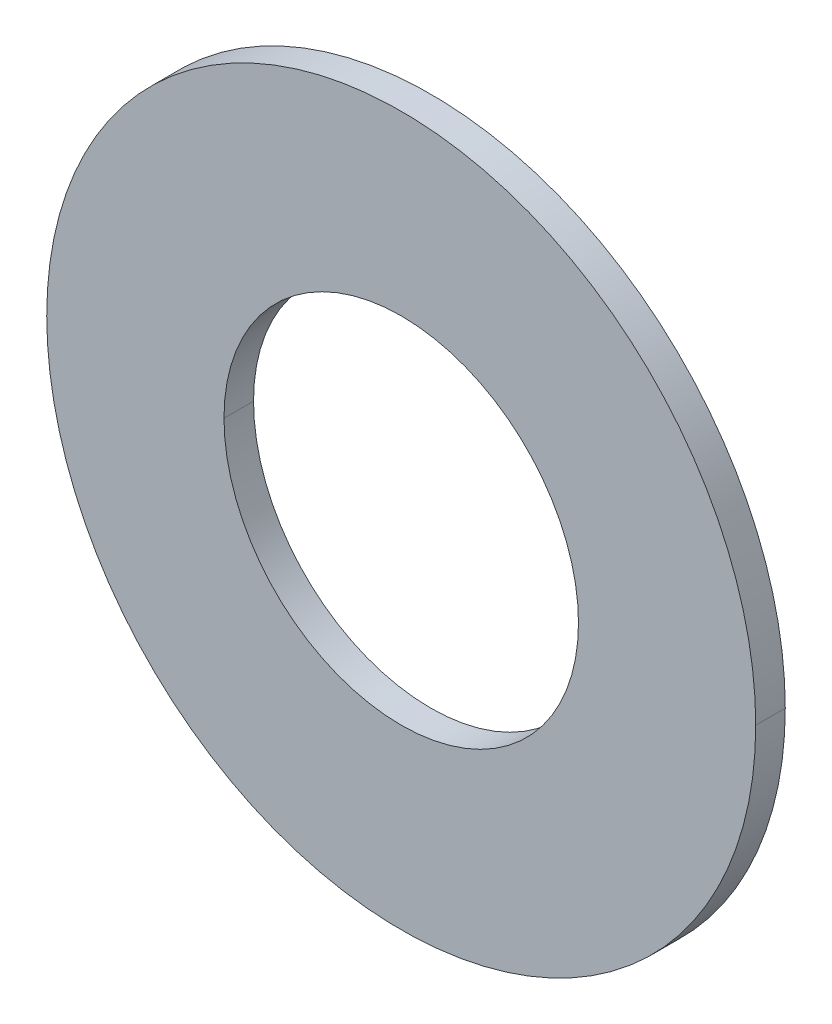
ISO-10303-21;
HEADER;
FILE_DESCRIPTION(('STEP AP214'),'2;1');
FILE_NAME('part.step','',(''),(''),'','','');
FILE_SCHEMA(('AUTOMOTIVE_DESIGN { 1 0 10303 214 1 1 1 1 }'));
ENDSEC;
DATA;
#1=APPLICATION_CONTEXT('core data for automotive mechanical design processes');
#2=APPLICATION_PROTOCOL_DEFINITION('international standard','automotive_design',2000,#1);
#3=PRODUCT_CONTEXT('',#1,'mechanical');
#4=PRODUCT('Part','Part','',(#3));
#5=PRODUCT_RELATED_PRODUCT_CATEGORY('part','',(#4));
#6=PRODUCT_DEFINITION_FORMATION('','',#4);
#7=PRODUCT_DEFINITION_CONTEXT('part definition',#1,'design');
#8=PRODUCT_DEFINITION('design','',#6,#7);
#9=PRODUCT_DEFINITION_SHAPE('','',#8);
#10=(LENGTH_UNIT() NAMED_UNIT(*) SI_UNIT(.MILLI.,.METRE.));
#11=(NAMED_UNIT(*) PLANE_ANGLE_UNIT() SI_UNIT($,.RADIAN.));
#12=(NAMED_UNIT(*) SI_UNIT($,.STERADIAN.) SOLID_ANGLE_UNIT());
#13=UNCERTAINTY_MEASURE_WITH_UNIT(LENGTH_MEASURE(1.E-05),#10,'distance_accuracy_value','');
#14=(GEOMETRIC_REPRESENTATION_CONTEXT(3) GLOBAL_UNCERTAINTY_ASSIGNED_CONTEXT((#13)) GLOBAL_UNIT_ASSIGNED_CONTEXT((#10,
#11,#12)) REPRESENTATION_CONTEXT('',''));
#15=CARTESIAN_POINT('',(0.,0.,0.));
#16=DIRECTION('',(0.,0.,1.));
#17=DIRECTION('',(1.,0.,0.));
#18=AXIS2_PLACEMENT_3D('',#15,#16,#17);
#19=CARTESIAN_POINT('',(0.,0.,0.5));
#20=DIRECTION('',(0.,0.,-1.));
#21=DIRECTION('',(-1.,0.,0.));
#22=AXIS2_PLACEMENT_3D('',#19,#20,#21);
#23=CYLINDRICAL_SURFACE('',#22,3.);
#24=DIRECTION('',(0.,0.,-1.));
#25=VECTOR('',#24,1.);
#26=CARTESIAN_POINT('',(3.,0.,0.5));
#27=LINE('',#26,#25);
#28=CARTESIAN_POINT('',(3.,0.,0.5));
#29=VERTEX_POINT('',#28);
#30=CARTESIAN_POINT('',(3.,0.,0.));
#31=VERTEX_POINT('',#30);
#32=EDGE_CURVE('E81',#29,#31,#27,.T.);
#33=ORIENTED_EDGE('',*,*,#32,.F.);
#34=CARTESIAN_POINT('',(0.,0.,0.5));
#35=DIRECTION('',(0.,0.,1.));
#36=DIRECTION('',(1.,0.,0.));
#37=AXIS2_PLACEMENT_3D('',#34,#35,#36);
#38=CIRCLE('',#37,3.);
#39=CARTESIAN_POINT('',(-3.,0.,0.5));
#40=VERTEX_POINT('',#39);
#41=EDGE_CURVE('E68',#29,#40,#38,.T.);
#42=ORIENTED_EDGE('',*,*,#41,.T.);
#43=DIRECTION('',(0.,0.,-1.));
#44=VECTOR('',#43,1.);
#45=CARTESIAN_POINT('',(-3.,0.,0.5));
#46=LINE('',#45,#44);
#47=CARTESIAN_POINT('',(-3.,0.,0.));
#48=VERTEX_POINT('',#47);
#49=EDGE_CURVE('E89',#40,#48,#46,.T.);
#50=ORIENTED_EDGE('',*,*,#49,.T.);
#51=CARTESIAN_POINT('',(0.,0.,0.));
#52=DIRECTION('',(0.,0.,1.));
#53=DIRECTION('',(1.,0.,0.));
#54=AXIS2_PLACEMENT_3D('',#51,#52,#53);
#55=CIRCLE('',#54,3.);
#56=EDGE_CURVE('E9',#31,#48,#55,.T.);
#57=ORIENTED_EDGE('',*,*,#56,.F.);
#58=EDGE_LOOP('',(#33,#42,#50,#57));
#59=FACE_BOUND('',#58,.T.);
#60=ADVANCED_FACE('F15',(#59),#23,.F.);
#61=CARTESIAN_POINT('',(0.,0.,0.5));
#62=DIRECTION('',(0.,0.,-1.));
#63=DIRECTION('',(-1.,0.,0.));
#64=AXIS2_PLACEMENT_3D('',#61,#62,#63);
#65=CYLINDRICAL_SURFACE('',#64,6.);
#66=DIRECTION('',(0.,0.,-1.));
#67=VECTOR('',#66,1.);
#68=CARTESIAN_POINT('',(6.,0.,0.5));
#69=LINE('',#68,#67);
#70=CARTESIAN_POINT('',(6.,0.,0.5));
#71=VERTEX_POINT('',#70);
#72=CARTESIAN_POINT('',(6.,0.,0.));
#73=VERTEX_POINT('',#72);
#74=EDGE_CURVE('E97',#71,#73,#69,.T.);
#75=ORIENTED_EDGE('',*,*,#74,.F.);
#76=CARTESIAN_POINT('',(0.,0.,0.5));
#77=DIRECTION('',(0.,0.,1.));
#78=DIRECTION('',(1.,0.,0.));
#79=AXIS2_PLACEMENT_3D('',#76,#77,#78);
#80=CIRCLE('',#79,6.);
#81=CARTESIAN_POINT('',(-6.,0.,0.5));
#82=VERTEX_POINT('',#81);
#83=EDGE_CURVE('E78',#82,#71,#80,.T.);
#84=ORIENTED_EDGE('',*,*,#83,.F.);
#85=DIRECTION('',(0.,0.,-1.));
#86=VECTOR('',#85,1.);
#87=CARTESIAN_POINT('',(-6.,0.,0.5));
#88=LINE('',#87,#86);
#89=CARTESIAN_POINT('',(-6.,0.,0.));
#90=VERTEX_POINT('',#89);
#91=EDGE_CURVE('E105',#82,#90,#88,.T.);
#92=ORIENTED_EDGE('',*,*,#91,.T.);
#93=CARTESIAN_POINT('',(0.,0.,0.));
#94=DIRECTION('',(0.,0.,1.));
#95=DIRECTION('',(1.,0.,0.));
#96=AXIS2_PLACEMENT_3D('',#93,#94,#95);
#97=CIRCLE('',#96,6.);
#98=EDGE_CURVE('E23',#90,#73,#97,.T.);
#99=ORIENTED_EDGE('',*,*,#98,.T.);
#100=EDGE_LOOP('',(#75,#84,#92,#99));
#101=FACE_BOUND('',#100,.T.);
#102=ADVANCED_FACE('F215',(#101),#65,.T.);
#103=CARTESIAN_POINT('',(0.,0.,0.));
#104=DIRECTION('',(0.,0.,1.));
#105=DIRECTION('',(1.,0.,0.));
#106=AXIS2_PLACEMENT_3D('',#103,#104,#105);
#107=PLANE('',#106);
#108=CARTESIAN_POINT('',(0.,0.,0.));
#109=DIRECTION('',(0.,0.,1.));
#110=DIRECTION('',(1.,0.,0.));
#111=AXIS2_PLACEMENT_3D('',#108,#109,#110);
#112=CIRCLE('',#111,3.);
#113=EDGE_CURVE('E86',#48,#31,#112,.T.);
#114=ORIENTED_EDGE('',*,*,#113,.T.);
#115=ORIENTED_EDGE('',*,*,#56,.T.);
#116=EDGE_LOOP('',(#114,#115));
#117=FACE_BOUND('',#116,.T.);
#118=ORIENTED_EDGE('',*,*,#98,.F.);
#119=CARTESIAN_POINT('',(0.,0.,0.));
#120=DIRECTION('',(0.,0.,1.));
#121=DIRECTION('',(1.,0.,0.));
#122=AXIS2_PLACEMENT_3D('',#119,#120,#121);
#123=CIRCLE('',#122,6.);
#124=EDGE_CURVE('E109',#73,#90,#123,.T.);
#125=ORIENTED_EDGE('',*,*,#124,.F.);
#126=EDGE_LOOP('',(#118,#125));
#127=FACE_BOUND('',#126,.T.);
#128=ADVANCED_FACE('F205',(#117,#127),#107,.F.);
#129=CARTESIAN_POINT('',(0.,0.,0.5));
#130=DIRECTION('',(0.,0.,1.));
#131=DIRECTION('',(1.,0.,0.));
#132=AXIS2_PLACEMENT_3D('',#129,#130,#131);
#133=PLANE('',#132);
#134=CARTESIAN_POINT('',(0.,0.,0.5));
#135=DIRECTION('',(0.,0.,1.));
#136=DIRECTION('',(1.,0.,0.));
#137=AXIS2_PLACEMENT_3D('',#134,#135,#136);
#138=CIRCLE('',#137,3.);
#139=EDGE_CURVE('E73',#40,#29,#138,.T.);
#140=ORIENTED_EDGE('',*,*,#139,.F.);
#141=ORIENTED_EDGE('',*,*,#41,.F.);
#142=EDGE_LOOP('',(#140,#141));
#143=FACE_BOUND('',#142,.T.);
#144=ORIENTED_EDGE('',*,*,#83,.T.);
#145=CARTESIAN_POINT('',(0.,0.,0.5));
#146=DIRECTION('',(0.,0.,1.));
#147=DIRECTION('',(1.,0.,0.));
#148=AXIS2_PLACEMENT_3D('',#145,#146,#147);
#149=CIRCLE('',#148,6.);
#150=EDGE_CURVE('E99',#71,#82,#149,.T.);
#151=ORIENTED_EDGE('',*,*,#150,.T.);
#152=EDGE_LOOP('',(#144,#151));
#153=FACE_BOUND('',#152,.T.);
#154=ADVANCED_FACE('F70',(#143,#153),#133,.T.);
#155=CARTESIAN_POINT('',(0.,0.,0.5));
#156=DIRECTION('',(0.,0.,-1.));
#157=DIRECTION('',(-1.,0.,0.));
#158=AXIS2_PLACEMENT_3D('',#155,#156,#157);
#159=CYLINDRICAL_SURFACE('',#158,6.);
#160=ORIENTED_EDGE('',*,*,#150,.F.);
#161=ORIENTED_EDGE('',*,*,#74,.T.);
#162=ORIENTED_EDGE('',*,*,#124,.T.);
#163=ORIENTED_EDGE('',*,*,#91,.F.);
#164=EDGE_LOOP('',(#160,#161,#162,#163));
#165=FACE_BOUND('',#164,.T.);
#166=ADVANCED_FACE('F185',(#165),#159,.T.);
#167=CARTESIAN_POINT('',(0.,0.,0.5));
#168=DIRECTION('',(0.,0.,-1.));
#169=DIRECTION('',(-1.,0.,0.));
#170=AXIS2_PLACEMENT_3D('',#167,#168,#169);
#171=CYLINDRICAL_SURFACE('',#170,3.);
#172=ORIENTED_EDGE('',*,*,#139,.T.);
#173=ORIENTED_EDGE('',*,*,#32,.T.);
#174=ORIENTED_EDGE('',*,*,#113,.F.);
#175=ORIENTED_EDGE('',*,*,#49,.F.);
#176=EDGE_LOOP('',(#172,#173,#174,#175));
#177=FACE_BOUND('',#176,.T.);
#178=ADVANCED_FACE('F88',(#177),#171,.F.);
#179=CLOSED_SHELL('',(#60,#102,#128,#154,#166,#178));
#180=MANIFOLD_SOLID_BREP('B1',#179);
#181=ADVANCED_BREP_SHAPE_REPRESENTATION('',(#18,#180),#14);
#182=SHAPE_DEFINITION_REPRESENTATION(#9,#181);
ENDSEC;
END-ISO-10303-21;
